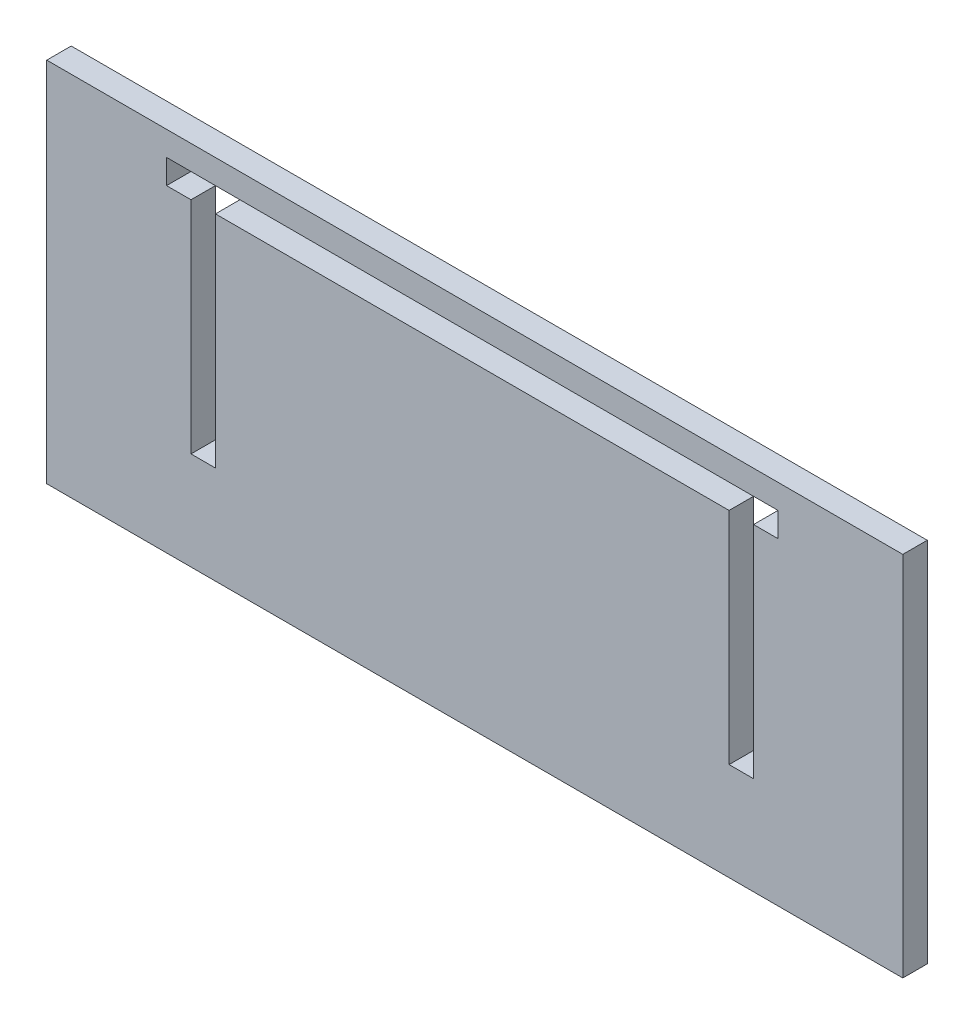
ISO-10303-21;
HEADER;
FILE_DESCRIPTION(('STEP AP214'),'2;1');
FILE_NAME('part.step','',(''),(''),'','','');
FILE_SCHEMA(('AUTOMOTIVE_DESIGN { 1 0 10303 214 1 1 1 1 }'));
ENDSEC;
DATA;
#1=APPLICATION_CONTEXT('core data for automotive mechanical design processes');
#2=APPLICATION_PROTOCOL_DEFINITION('international standard','automotive_design',2000,#1);
#3=PRODUCT_CONTEXT('',#1,'mechanical');
#4=PRODUCT('Part','Part','',(#3));
#5=PRODUCT_RELATED_PRODUCT_CATEGORY('part','',(#4));
#6=PRODUCT_DEFINITION_FORMATION('','',#4);
#7=PRODUCT_DEFINITION_CONTEXT('part definition',#1,'design');
#8=PRODUCT_DEFINITION('design','',#6,#7);
#9=PRODUCT_DEFINITION_SHAPE('','',#8);
#10=(LENGTH_UNIT() NAMED_UNIT(*) SI_UNIT(.MILLI.,.METRE.));
#11=(NAMED_UNIT(*) PLANE_ANGLE_UNIT() SI_UNIT($,.RADIAN.));
#12=(NAMED_UNIT(*) SI_UNIT($,.STERADIAN.) SOLID_ANGLE_UNIT());
#13=UNCERTAINTY_MEASURE_WITH_UNIT(LENGTH_MEASURE(1.E-05),#10,'distance_accuracy_value','');
#14=(GEOMETRIC_REPRESENTATION_CONTEXT(3) GLOBAL_UNCERTAINTY_ASSIGNED_CONTEXT((#13)) GLOBAL_UNIT_ASSIGNED_CONTEXT((#10,
#11,#12)) REPRESENTATION_CONTEXT('',''));
#15=CARTESIAN_POINT('',(0.,0.,0.));
#16=DIRECTION('',(0.,0.,1.));
#17=DIRECTION('',(1.,0.,0.));
#18=AXIS2_PLACEMENT_3D('',#15,#16,#17);
#19=CARTESIAN_POINT('',(0.,5.83196236741988,5.));
#20=DIRECTION('',(0.,1.,0.));
#21=DIRECTION('',(0.,0.,1.));
#22=AXIS2_PLACEMENT_3D('',#19,#20,#21);
#23=PLANE('',#22);
#24=DIRECTION('',(1.,0.,0.));
#25=VECTOR('',#24,1.);
#26=CARTESIAN_POINT('',(0.,5.83196236741988,0.));
#27=LINE('',#26,#25);
#28=CARTESIAN_POINT('',(66.6211877276406,5.83196236741988,0.));
#29=VERTEX_POINT('',#28);
#30=CARTESIAN_POINT('',(71.6211877276406,5.83196236741988,0.));
#31=VERTEX_POINT('',#30);
#32=EDGE_CURVE('E295',#29,#31,#27,.T.);
#33=ORIENTED_EDGE('',*,*,#32,.F.);
#34=DIRECTION('',(0.,0.,-1.));
#35=VECTOR('',#34,1.);
#36=CARTESIAN_POINT('',(66.6211877276406,5.83196236741988,5.));
#37=LINE('',#36,#35);
#38=CARTESIAN_POINT('',(66.6211877276406,5.83196236741988,5.));
#39=VERTEX_POINT('',#38);
#40=EDGE_CURVE('E12',#39,#29,#37,.T.);
#41=ORIENTED_EDGE('',*,*,#40,.F.);
#42=DIRECTION('',(1.,0.,0.));
#43=VECTOR('',#42,1.);
#44=CARTESIAN_POINT('',(0.,5.83196236741988,5.));
#45=LINE('',#44,#43);
#46=CARTESIAN_POINT('',(71.6211877276406,5.83196236741988,5.));
#47=VERTEX_POINT('',#46);
#48=EDGE_CURVE('E189',#39,#47,#45,.T.);
#49=ORIENTED_EDGE('',*,*,#48,.T.);
#50=DIRECTION('',(0.,0.,-1.));
#51=VECTOR('',#50,1.);
#52=CARTESIAN_POINT('',(71.6211877276406,5.83196236741988,5.));
#53=LINE('',#52,#51);
#54=EDGE_CURVE('E114',#47,#31,#53,.T.);
#55=ORIENTED_EDGE('',*,*,#54,.T.);
#56=EDGE_LOOP('',(#33,#41,#49,#55));
#57=FACE_BOUND('',#56,.T.);
#58=ADVANCED_FACE('F36',(#57),#23,.T.);
#59=CARTESIAN_POINT('',(66.6211877276406,0.,5.));
#60=DIRECTION('',(1.,0.,0.));
#61=DIRECTION('',(0.,0.,-1.));
#62=AXIS2_PLACEMENT_3D('',#59,#60,#61);
#63=PLANE('',#62);
#64=DIRECTION('',(0.,-1.,0.));
#65=VECTOR('',#64,1.);
#66=CARTESIAN_POINT('',(66.6211877276406,0.,0.));
#67=LINE('',#66,#65);
#68=CARTESIAN_POINT('',(66.6211877276406,-39.1680376325801,0.));
#69=VERTEX_POINT('',#68);
#70=EDGE_CURVE('E292',#29,#69,#67,.T.);
#71=ORIENTED_EDGE('',*,*,#70,.T.);
#72=DIRECTION('',(0.,0.,-1.));
#73=VECTOR('',#72,1.);
#74=CARTESIAN_POINT('',(66.6211877276406,-39.1680376325801,5.));
#75=LINE('',#74,#73);
#76=CARTESIAN_POINT('',(66.6211877276406,-39.1680376325801,5.));
#77=VERTEX_POINT('',#76);
#78=EDGE_CURVE('E46',#77,#69,#75,.T.);
#79=ORIENTED_EDGE('',*,*,#78,.F.);
#80=DIRECTION('',(0.,-1.,0.));
#81=VECTOR('',#80,1.);
#82=CARTESIAN_POINT('',(66.6211877276406,0.,5.));
#83=LINE('',#82,#81);
#84=EDGE_CURVE('E203',#39,#77,#83,.T.);
#85=ORIENTED_EDGE('',*,*,#84,.F.);
#86=ORIENTED_EDGE('',*,*,#40,.T.);
#87=EDGE_LOOP('',(#71,#79,#85,#86));
#88=FACE_BOUND('',#87,.T.);
#89=ADVANCED_FACE('F346',(#88),#63,.F.);
#90=CARTESIAN_POINT('',(0.,-39.1680376325802,5.));
#91=DIRECTION('',(0.,1.,0.));
#92=DIRECTION('',(-1.,0.,0.));
#93=AXIS2_PLACEMENT_3D('',#90,#91,#92);
#94=PLANE('',#93);
#95=DIRECTION('',(1.,0.,0.));
#96=VECTOR('',#95,1.);
#97=CARTESIAN_POINT('',(0.,-39.1680376325802,0.));
#98=LINE('',#97,#96);
#99=CARTESIAN_POINT('',(61.6211877276406,-39.1680376325801,0.));
#100=VERTEX_POINT('',#99);
#101=EDGE_CURVE('E289',#100,#69,#98,.T.);
#102=ORIENTED_EDGE('',*,*,#101,.F.);
#103=DIRECTION('',(0.,0.,-1.));
#104=VECTOR('',#103,1.);
#105=CARTESIAN_POINT('',(61.6211877276406,-39.1680376325801,5.));
#106=LINE('',#105,#104);
#107=CARTESIAN_POINT('',(61.6211877276406,-39.1680376325801,5.));
#108=VERTEX_POINT('',#107);
#109=EDGE_CURVE('E255',#108,#100,#106,.T.);
#110=ORIENTED_EDGE('',*,*,#109,.F.);
#111=DIRECTION('',(1.,0.,0.));
#112=VECTOR('',#111,1.);
#113=CARTESIAN_POINT('',(0.,-39.1680376325802,5.));
#114=LINE('',#113,#112);
#115=EDGE_CURVE('E502',#108,#77,#114,.T.);
#116=ORIENTED_EDGE('',*,*,#115,.T.);
#117=ORIENTED_EDGE('',*,*,#78,.T.);
#118=EDGE_LOOP('',(#102,#110,#116,#117));
#119=FACE_BOUND('',#118,.T.);
#120=ADVANCED_FACE('F352',(#119),#94,.T.);
#121=CARTESIAN_POINT('',(61.6211877276406,0.,5.));
#122=DIRECTION('',(1.,0.,0.));
#123=DIRECTION('',(0.,1.,0.));
#124=AXIS2_PLACEMENT_3D('',#121,#122,#123);
#125=PLANE('',#124);
#126=DIRECTION('',(0.,-1.,0.));
#127=VECTOR('',#126,1.);
#128=CARTESIAN_POINT('',(61.6211877276406,0.,0.));
#129=LINE('',#128,#127);
#130=CARTESIAN_POINT('',(61.6211877276406,5.83196236741988,0.));
#131=VERTEX_POINT('',#130);
#132=EDGE_CURVE('E286',#131,#100,#129,.T.);
#133=ORIENTED_EDGE('',*,*,#132,.F.);
#134=DIRECTION('',(0.,0.,-1.));
#135=VECTOR('',#134,1.);
#136=CARTESIAN_POINT('',(61.6211877276406,5.83196236741988,5.));
#137=LINE('',#136,#135);
#138=CARTESIAN_POINT('',(61.6211877276406,5.83196236741988,5.));
#139=VERTEX_POINT('',#138);
#140=EDGE_CURVE('E253',#139,#131,#137,.T.);
#141=ORIENTED_EDGE('',*,*,#140,.F.);
#142=DIRECTION('',(0.,-1.,0.));
#143=VECTOR('',#142,1.);
#144=CARTESIAN_POINT('',(61.6211877276406,0.,5.));
#145=LINE('',#144,#143);
#146=EDGE_CURVE('E224',#139,#108,#145,.T.);
#147=ORIENTED_EDGE('',*,*,#146,.T.);
#148=ORIENTED_EDGE('',*,*,#109,.T.);
#149=EDGE_LOOP('',(#133,#141,#147,#148));
#150=FACE_BOUND('',#149,.T.);
#151=ADVANCED_FACE('F359',(#150),#125,.T.);
#152=CARTESIAN_POINT('',(-43.3788122723594,5.83196236741988,0.));
#153=VERTEX_POINT('',#152);
#154=EDGE_CURVE('E285',#153,#131,#27,.T.);
#155=ORIENTED_EDGE('',*,*,#154,.F.);
#156=DIRECTION('',(0.,0.,-1.));
#157=VECTOR('',#156,1.);
#158=CARTESIAN_POINT('',(-43.3788122723594,5.83196236741988,5.));
#159=LINE('',#158,#157);
#160=CARTESIAN_POINT('',(-43.3788122723594,5.83196236741988,5.));
#161=VERTEX_POINT('',#160);
#162=EDGE_CURVE('E251',#161,#153,#159,.T.);
#163=ORIENTED_EDGE('',*,*,#162,.F.);
#164=EDGE_CURVE('E188',#161,#139,#45,.T.);
#165=ORIENTED_EDGE('',*,*,#164,.T.);
#166=ORIENTED_EDGE('',*,*,#140,.T.);
#167=EDGE_LOOP('',(#155,#163,#165,#166));
#168=FACE_BOUND('',#167,.T.);
#169=ADVANCED_FACE('F348',(#168),#23,.T.);
#170=CARTESIAN_POINT('',(-43.3788122723594,0.,5.));
#171=DIRECTION('',(1.,0.,0.));
#172=DIRECTION('',(0.,0.,-1.));
#173=AXIS2_PLACEMENT_3D('',#170,#171,#172);
#174=PLANE('',#173);
#175=DIRECTION('',(0.,-1.,0.));
#176=VECTOR('',#175,1.);
#177=CARTESIAN_POINT('',(-43.3788122723594,0.,0.));
#178=LINE('',#177,#176);
#179=CARTESIAN_POINT('',(-43.3788122723594,-39.1680376325801,0.));
#180=VERTEX_POINT('',#179);
#181=EDGE_CURVE('E282',#153,#180,#178,.T.);
#182=ORIENTED_EDGE('',*,*,#181,.T.);
#183=DIRECTION('',(0.,0.,-1.));
#184=VECTOR('',#183,1.);
#185=CARTESIAN_POINT('',(-43.3788122723594,-39.1680376325801,5.));
#186=LINE('',#185,#184);
#187=CARTESIAN_POINT('',(-43.3788122723594,-39.1680376325801,5.));
#188=VERTEX_POINT('',#187);
#189=EDGE_CURVE('E249',#188,#180,#186,.T.);
#190=ORIENTED_EDGE('',*,*,#189,.F.);
#191=DIRECTION('',(0.,-1.,0.));
#192=VECTOR('',#191,1.);
#193=CARTESIAN_POINT('',(-43.3788122723594,0.,5.));
#194=LINE('',#193,#192);
#195=EDGE_CURVE('E220',#161,#188,#194,.T.);
#196=ORIENTED_EDGE('',*,*,#195,.F.);
#197=ORIENTED_EDGE('',*,*,#162,.T.);
#198=EDGE_LOOP('',(#182,#190,#196,#197));
#199=FACE_BOUND('',#198,.T.);
#200=ADVANCED_FACE('F358',(#199),#174,.F.);
#201=CARTESIAN_POINT('',(0.,-39.1680376325801,5.));
#202=DIRECTION('',(0.,1.,0.));
#203=DIRECTION('',(0.,0.,1.));
#204=AXIS2_PLACEMENT_3D('',#201,#202,#203);
#205=PLANE('',#204);
#206=DIRECTION('',(1.,0.,0.));
#207=VECTOR('',#206,1.);
#208=CARTESIAN_POINT('',(0.,-39.1680376325801,0.));
#209=LINE('',#208,#207);
#210=CARTESIAN_POINT('',(-48.3788122723594,-39.1680376325801,0.));
#211=VERTEX_POINT('',#210);
#212=EDGE_CURVE('E279',#211,#180,#209,.T.);
#213=ORIENTED_EDGE('',*,*,#212,.F.);
#214=DIRECTION('',(0.,0.,-1.));
#215=VECTOR('',#214,1.);
#216=CARTESIAN_POINT('',(-48.3788122723594,-39.1680376325801,5.));
#217=LINE('',#216,#215);
#218=CARTESIAN_POINT('',(-48.3788122723594,-39.1680376325801,5.));
#219=VERTEX_POINT('',#218);
#220=EDGE_CURVE('E236',#219,#211,#217,.T.);
#221=ORIENTED_EDGE('',*,*,#220,.F.);
#222=DIRECTION('',(1.,0.,0.));
#223=VECTOR('',#222,1.);
#224=CARTESIAN_POINT('',(0.,-39.1680376325801,5.));
#225=LINE('',#224,#223);
#226=EDGE_CURVE('E223',#219,#188,#225,.T.);
#227=ORIENTED_EDGE('',*,*,#226,.T.);
#228=ORIENTED_EDGE('',*,*,#189,.T.);
#229=EDGE_LOOP('',(#213,#221,#227,#228));
#230=FACE_BOUND('',#229,.T.);
#231=ADVANCED_FACE('F366',(#230),#205,.T.);
#232=CARTESIAN_POINT('',(-48.3788122723594,0.,5.));
#233=DIRECTION('',(1.,0.,0.));
#234=DIRECTION('',(0.,0.,-1.));
#235=AXIS2_PLACEMENT_3D('',#232,#233,#234);
#236=PLANE('',#235);
#237=DIRECTION('',(0.,-1.,0.));
#238=VECTOR('',#237,1.);
#239=CARTESIAN_POINT('',(-48.3788122723594,0.,0.));
#240=LINE('',#239,#238);
#241=CARTESIAN_POINT('',(-48.3788122723594,5.83196236741988,0.));
#242=VERTEX_POINT('',#241);
#243=EDGE_CURVE('E276',#242,#211,#240,.T.);
#244=ORIENTED_EDGE('',*,*,#243,.F.);
#245=DIRECTION('',(0.,0.,-1.));
#246=VECTOR('',#245,1.);
#247=CARTESIAN_POINT('',(-48.3788122723594,5.83196236741988,5.));
#248=LINE('',#247,#246);
#249=CARTESIAN_POINT('',(-48.3788122723594,5.83196236741988,5.));
#250=VERTEX_POINT('',#249);
#251=EDGE_CURVE('E238',#250,#242,#248,.T.);
#252=ORIENTED_EDGE('',*,*,#251,.F.);
#253=DIRECTION('',(0.,-1.,0.));
#254=VECTOR('',#253,1.);
#255=CARTESIAN_POINT('',(-48.3788122723594,0.,5.));
#256=LINE('',#255,#254);
#257=EDGE_CURVE('E186',#250,#219,#256,.T.);
#258=ORIENTED_EDGE('',*,*,#257,.T.);
#259=ORIENTED_EDGE('',*,*,#220,.T.);
#260=EDGE_LOOP('',(#244,#252,#258,#259));
#261=FACE_BOUND('',#260,.T.);
#262=ADVANCED_FACE('F235',(#261),#236,.T.);
#263=CARTESIAN_POINT('',(-53.3788122723594,5.83196236741988,0.));
#264=VERTEX_POINT('',#263);
#265=EDGE_CURVE('E243',#264,#242,#27,.T.);
#266=ORIENTED_EDGE('',*,*,#265,.F.);
#267=DIRECTION('',(0.,0.,-1.));
#268=VECTOR('',#267,1.);
#269=CARTESIAN_POINT('',(-53.3788122723594,5.83196236741988,5.));
#270=LINE('',#269,#268);
#271=CARTESIAN_POINT('',(-53.3788122723594,5.83196236741988,5.));
#272=VERTEX_POINT('',#271);
#273=EDGE_CURVE('E170',#272,#264,#270,.T.);
#274=ORIENTED_EDGE('',*,*,#273,.F.);
#275=EDGE_CURVE('E182',#272,#250,#45,.T.);
#276=ORIENTED_EDGE('',*,*,#275,.T.);
#277=ORIENTED_EDGE('',*,*,#251,.T.);
#278=EDGE_LOOP('',(#266,#274,#276,#277));
#279=FACE_BOUND('',#278,.T.);
#280=ADVANCED_FACE('F241',(#279),#23,.T.);
#281=CARTESIAN_POINT('',(-53.3788122723594,0.,5.));
#282=DIRECTION('',(1.,0.,0.));
#283=DIRECTION('',(0.,0.,-1.));
#284=AXIS2_PLACEMENT_3D('',#281,#282,#283);
#285=PLANE('',#284);
#286=DIRECTION('',(0.,-1.,0.));
#287=VECTOR('',#286,1.);
#288=CARTESIAN_POINT('',(-53.3788122723594,0.,0.));
#289=LINE('',#288,#287);
#290=CARTESIAN_POINT('',(-53.3788122723594,10.8319623674199,0.));
#291=VERTEX_POINT('',#290);
#292=EDGE_CURVE('E167',#291,#264,#289,.T.);
#293=ORIENTED_EDGE('',*,*,#292,.F.);
#294=DIRECTION('',(0.,0.,-1.));
#295=VECTOR('',#294,1.);
#296=CARTESIAN_POINT('',(-53.3788122723594,10.8319623674199,5.));
#297=LINE('',#296,#295);
#298=CARTESIAN_POINT('',(-53.3788122723594,10.8319623674199,5.));
#299=VERTEX_POINT('',#298);
#300=EDGE_CURVE('E161',#299,#291,#297,.T.);
#301=ORIENTED_EDGE('',*,*,#300,.F.);
#302=DIRECTION('',(0.,-1.,0.));
#303=VECTOR('',#302,1.);
#304=CARTESIAN_POINT('',(-53.3788122723594,0.,5.));
#305=LINE('',#304,#303);
#306=EDGE_CURVE('E165',#299,#272,#305,.T.);
#307=ORIENTED_EDGE('',*,*,#306,.T.);
#308=ORIENTED_EDGE('',*,*,#273,.T.);
#309=EDGE_LOOP('',(#293,#301,#307,#308));
#310=FACE_BOUND('',#309,.T.);
#311=ADVANCED_FACE('F163',(#310),#285,.T.);
#312=CARTESIAN_POINT('',(0.,10.8319623674199,5.));
#313=DIRECTION('',(0.,1.,0.));
#314=DIRECTION('',(0.,0.,1.));
#315=AXIS2_PLACEMENT_3D('',#312,#313,#314);
#316=PLANE('',#315);
#317=DIRECTION('',(1.,0.,0.));
#318=VECTOR('',#317,1.);
#319=CARTESIAN_POINT('',(0.,10.8319623674199,0.));
#320=LINE('',#319,#318);
#321=CARTESIAN_POINT('',(71.6211877276406,10.8319623674199,0.));
#322=VERTEX_POINT('',#321);
#323=EDGE_CURVE('E273',#291,#322,#320,.T.);
#324=ORIENTED_EDGE('',*,*,#323,.T.);
#325=DIRECTION('',(0.,0.,-1.));
#326=VECTOR('',#325,1.);
#327=CARTESIAN_POINT('',(71.6211877276406,10.8319623674199,5.));
#328=LINE('',#327,#326);
#329=CARTESIAN_POINT('',(71.6211877276406,10.8319623674199,5.));
#330=VERTEX_POINT('',#329);
#331=EDGE_CURVE('E171',#330,#322,#328,.T.);
#332=ORIENTED_EDGE('',*,*,#331,.F.);
#333=DIRECTION('',(1.,0.,0.));
#334=VECTOR('',#333,1.);
#335=CARTESIAN_POINT('',(0.,10.8319623674199,5.));
#336=LINE('',#335,#334);
#337=EDGE_CURVE('E174',#299,#330,#336,.T.);
#338=ORIENTED_EDGE('',*,*,#337,.F.);
#339=ORIENTED_EDGE('',*,*,#300,.T.);
#340=EDGE_LOOP('',(#324,#332,#338,#339));
#341=FACE_BOUND('',#340,.T.);
#342=ADVANCED_FACE('F175',(#341),#316,.F.);
#343=CARTESIAN_POINT('',(97.13163738037,0.,5.));
#344=DIRECTION('',(1.,0.,0.));
#345=DIRECTION('',(0.,1.,0.));
#346=AXIS2_PLACEMENT_3D('',#343,#344,#345);
#347=PLANE('',#346);
#348=DIRECTION('',(0.,-1.,0.));
#349=VECTOR('',#348,1.);
#350=CARTESIAN_POINT('',(97.13163738037,0.,0.));
#351=LINE('',#350,#349);
#352=CARTESIAN_POINT('',(97.13163738037,15.8058382355964,0.));
#353=VERTEX_POINT('',#352);
#354=CARTESIAN_POINT('',(97.13163738037,-59.1941617644036,0.));
#355=VERTEX_POINT('',#354);
#356=EDGE_CURVE('E305',#353,#355,#351,.T.);
#357=ORIENTED_EDGE('',*,*,#356,.F.);
#358=DIRECTION('',(0.,0.,-1.));
#359=VECTOR('',#358,1.);
#360=CARTESIAN_POINT('',(97.13163738037,15.8058382355964,5.));
#361=LINE('',#360,#359);
#362=CARTESIAN_POINT('',(97.13163738037,15.8058382355964,5.));
#363=VERTEX_POINT('',#362);
#364=EDGE_CURVE('E40',#363,#353,#361,.T.);
#365=ORIENTED_EDGE('',*,*,#364,.F.);
#366=DIRECTION('',(0.,-1.,0.));
#367=VECTOR('',#366,1.);
#368=CARTESIAN_POINT('',(97.13163738037,0.,5.));
#369=LINE('',#368,#367);
#370=CARTESIAN_POINT('',(97.13163738037,-59.1941617644036,5.));
#371=VERTEX_POINT('',#370);
#372=EDGE_CURVE('E272',#363,#371,#369,.T.);
#373=ORIENTED_EDGE('',*,*,#372,.T.);
#374=DIRECTION('',(0.,0.,-1.));
#375=VECTOR('',#374,1.);
#376=CARTESIAN_POINT('',(97.13163738037,-59.1941617644036,5.));
#377=LINE('',#376,#375);
#378=EDGE_CURVE('E258',#371,#355,#377,.T.);
#379=ORIENTED_EDGE('',*,*,#378,.T.);
#380=EDGE_LOOP('',(#357,#365,#373,#379));
#381=FACE_BOUND('',#380,.T.);
#382=ADVANCED_FACE('F38',(#381),#347,.T.);
#383=CARTESIAN_POINT('',(0.,15.8058382355964,5.));
#384=DIRECTION('',(0.,1.,0.));
#385=DIRECTION('',(0.,0.,1.));
#386=AXIS2_PLACEMENT_3D('',#383,#384,#385);
#387=PLANE('',#386);
#388=DIRECTION('',(1.,0.,0.));
#389=VECTOR('',#388,1.);
#390=CARTESIAN_POINT('',(0.,15.8058382355964,0.));
#391=LINE('',#390,#389);
#392=CARTESIAN_POINT('',(-77.86836261963,15.8058382355964,0.));
#393=VERTEX_POINT('',#392);
#394=EDGE_CURVE('E302',#393,#353,#391,.T.);
#395=ORIENTED_EDGE('',*,*,#394,.F.);
#396=DIRECTION('',(0.,0.,-1.));
#397=VECTOR('',#396,1.);
#398=CARTESIAN_POINT('',(-77.86836261963,15.8058382355964,5.));
#399=LINE('',#398,#397);
#400=CARTESIAN_POINT('',(-77.86836261963,15.8058382355964,5.));
#401=VERTEX_POINT('',#400);
#402=EDGE_CURVE('E262',#401,#393,#399,.T.);
#403=ORIENTED_EDGE('',*,*,#402,.F.);
#404=DIRECTION('',(1.,0.,0.));
#405=VECTOR('',#404,1.);
#406=CARTESIAN_POINT('',(0.,15.8058382355964,5.));
#407=LINE('',#406,#405);
#408=EDGE_CURVE('E321',#401,#363,#407,.T.);
#409=ORIENTED_EDGE('',*,*,#408,.T.);
#410=ORIENTED_EDGE('',*,*,#364,.T.);
#411=EDGE_LOOP('',(#395,#403,#409,#410));
#412=FACE_BOUND('',#411,.T.);
#413=ADVANCED_FACE('F320',(#412),#387,.T.);
#414=CARTESIAN_POINT('',(-77.86836261963,0.,5.));
#415=DIRECTION('',(1.,0.,0.));
#416=DIRECTION('',(0.,1.,0.));
#417=AXIS2_PLACEMENT_3D('',#414,#415,#416);
#418=PLANE('',#417);
#419=DIRECTION('',(0.,-1.,0.));
#420=VECTOR('',#419,1.);
#421=CARTESIAN_POINT('',(-77.86836261963,0.,0.));
#422=LINE('',#421,#420);
#423=CARTESIAN_POINT('',(-77.86836261963,-59.1941617644036,0.));
#424=VERTEX_POINT('',#423);
#425=EDGE_CURVE('E300',#393,#424,#422,.T.);
#426=ORIENTED_EDGE('',*,*,#425,.T.);
#427=DIRECTION('',(0.,0.,-1.));
#428=VECTOR('',#427,1.);
#429=CARTESIAN_POINT('',(-77.86836261963,-59.1941617644036,5.));
#430=LINE('',#429,#428);
#431=CARTESIAN_POINT('',(-77.86836261963,-59.1941617644036,5.));
#432=VERTEX_POINT('',#431);
#433=EDGE_CURVE('E260',#432,#424,#430,.T.);
#434=ORIENTED_EDGE('',*,*,#433,.F.);
#435=DIRECTION('',(0.,-1.,0.));
#436=VECTOR('',#435,1.);
#437=CARTESIAN_POINT('',(-77.86836261963,0.,5.));
#438=LINE('',#437,#436);
#439=EDGE_CURVE('E318',#401,#432,#438,.T.);
#440=ORIENTED_EDGE('',*,*,#439,.F.);
#441=ORIENTED_EDGE('',*,*,#402,.T.);
#442=EDGE_LOOP('',(#426,#434,#440,#441));
#443=FACE_BOUND('',#442,.T.);
#444=ADVANCED_FACE('F317',(#443),#418,.F.);
#445=CARTESIAN_POINT('',(0.,-59.1941617644036,5.));
#446=DIRECTION('',(0.,1.,0.));
#447=DIRECTION('',(0.,0.,1.));
#448=AXIS2_PLACEMENT_3D('',#445,#446,#447);
#449=PLANE('',#448);
#450=DIRECTION('',(1.,0.,0.));
#451=VECTOR('',#450,1.);
#452=CARTESIAN_POINT('',(0.,-59.1941617644036,0.));
#453=LINE('',#452,#451);
#454=EDGE_CURVE('E297',#424,#355,#453,.T.);
#455=ORIENTED_EDGE('',*,*,#454,.T.);
#456=ORIENTED_EDGE('',*,*,#378,.F.);
#457=DIRECTION('',(1.,0.,0.));
#458=VECTOR('',#457,1.);
#459=CARTESIAN_POINT('',(0.,-59.1941617644036,5.));
#460=LINE('',#459,#458);
#461=EDGE_CURVE('E204',#432,#371,#460,.T.);
#462=ORIENTED_EDGE('',*,*,#461,.F.);
#463=ORIENTED_EDGE('',*,*,#433,.T.);
#464=EDGE_LOOP('',(#455,#456,#462,#463));
#465=FACE_BOUND('',#464,.T.);
#466=ADVANCED_FACE('F315',(#465),#449,.F.);
#467=CARTESIAN_POINT('',(71.6211877276406,0.,5.));
#468=DIRECTION('',(1.,0.,0.));
#469=DIRECTION('',(0.,0.,-1.));
#470=AXIS2_PLACEMENT_3D('',#467,#468,#469);
#471=PLANE('',#470);
#472=DIRECTION('',(0.,-1.,0.));
#473=VECTOR('',#472,1.);
#474=CARTESIAN_POINT('',(71.6211877276406,0.,0.));
#475=LINE('',#474,#473);
#476=EDGE_CURVE('E107',#322,#31,#475,.T.);
#477=ORIENTED_EDGE('',*,*,#476,.T.);
#478=ORIENTED_EDGE('',*,*,#54,.F.);
#479=DIRECTION('',(0.,-1.,0.));
#480=VECTOR('',#479,1.);
#481=CARTESIAN_POINT('',(71.6211877276406,0.,5.));
#482=LINE('',#481,#480);
#483=EDGE_CURVE('E55',#330,#47,#482,.T.);
#484=ORIENTED_EDGE('',*,*,#483,.F.);
#485=ORIENTED_EDGE('',*,*,#331,.T.);
#486=EDGE_LOOP('',(#477,#478,#484,#485));
#487=FACE_BOUND('',#486,.T.);
#488=ADVANCED_FACE('F336',(#487),#471,.F.);
#489=CARTESIAN_POINT('',(0.,0.,5.));
#490=DIRECTION('',(0.,0.,1.));
#491=DIRECTION('',(1.,0.,0.));
#492=AXIS2_PLACEMENT_3D('',#489,#490,#491);
#493=PLANE('',#492);
#494=ORIENTED_EDGE('',*,*,#372,.F.);
#495=ORIENTED_EDGE('',*,*,#408,.F.);
#496=ORIENTED_EDGE('',*,*,#439,.T.);
#497=ORIENTED_EDGE('',*,*,#461,.T.);
#498=EDGE_LOOP('',(#494,#495,#496,#497));
#499=FACE_BOUND('',#498,.T.);
#500=ORIENTED_EDGE('',*,*,#48,.F.);
#501=ORIENTED_EDGE('',*,*,#84,.T.);
#502=ORIENTED_EDGE('',*,*,#115,.F.);
#503=ORIENTED_EDGE('',*,*,#146,.F.);
#504=ORIENTED_EDGE('',*,*,#164,.F.);
#505=ORIENTED_EDGE('',*,*,#195,.T.);
#506=ORIENTED_EDGE('',*,*,#226,.F.);
#507=ORIENTED_EDGE('',*,*,#257,.F.);
#508=ORIENTED_EDGE('',*,*,#275,.F.);
#509=ORIENTED_EDGE('',*,*,#306,.F.);
#510=ORIENTED_EDGE('',*,*,#337,.T.);
#511=ORIENTED_EDGE('',*,*,#483,.T.);
#512=EDGE_LOOP('',(#500,#501,#502,#503,#504,#505,#506,#507,#508,#509,#510,#511));
#513=FACE_BOUND('',#512,.T.);
#514=ADVANCED_FACE('F179',(#499,#513),#493,.T.);
#515=CARTESIAN_POINT('',(0.,0.,0.));
#516=DIRECTION('',(0.,0.,1.));
#517=DIRECTION('',(1.,0.,0.));
#518=AXIS2_PLACEMENT_3D('',#515,#516,#517);
#519=PLANE('',#518);
#520=ORIENTED_EDGE('',*,*,#356,.T.);
#521=ORIENTED_EDGE('',*,*,#454,.F.);
#522=ORIENTED_EDGE('',*,*,#425,.F.);
#523=ORIENTED_EDGE('',*,*,#394,.T.);
#524=EDGE_LOOP('',(#520,#521,#522,#523));
#525=FACE_BOUND('',#524,.T.);
#526=ORIENTED_EDGE('',*,*,#32,.T.);
#527=ORIENTED_EDGE('',*,*,#476,.F.);
#528=ORIENTED_EDGE('',*,*,#323,.F.);
#529=ORIENTED_EDGE('',*,*,#292,.T.);
#530=ORIENTED_EDGE('',*,*,#265,.T.);
#531=ORIENTED_EDGE('',*,*,#243,.T.);
#532=ORIENTED_EDGE('',*,*,#212,.T.);
#533=ORIENTED_EDGE('',*,*,#181,.F.);
#534=ORIENTED_EDGE('',*,*,#154,.T.);
#535=ORIENTED_EDGE('',*,*,#132,.T.);
#536=ORIENTED_EDGE('',*,*,#101,.T.);
#537=ORIENTED_EDGE('',*,*,#70,.F.);
#538=EDGE_LOOP('',(#526,#527,#528,#529,#530,#531,#532,#533,#534,#535,#536,#537));
#539=FACE_BOUND('',#538,.T.);
#540=ADVANCED_FACE('F311',(#525,#539),#519,.F.);
#541=CLOSED_SHELL('',(#58,#89,#120,#151,#169,#200,#231,#262,#280,#311,#342,#382,#413,#444,#466,
#488,#514,#540));
#542=MANIFOLD_SOLID_BREP('B2',#541);
#543=ADVANCED_BREP_SHAPE_REPRESENTATION('',(#18,#542),#14);
#544=SHAPE_DEFINITION_REPRESENTATION(#9,#543);
ENDSEC;
END-ISO-10303-21;
